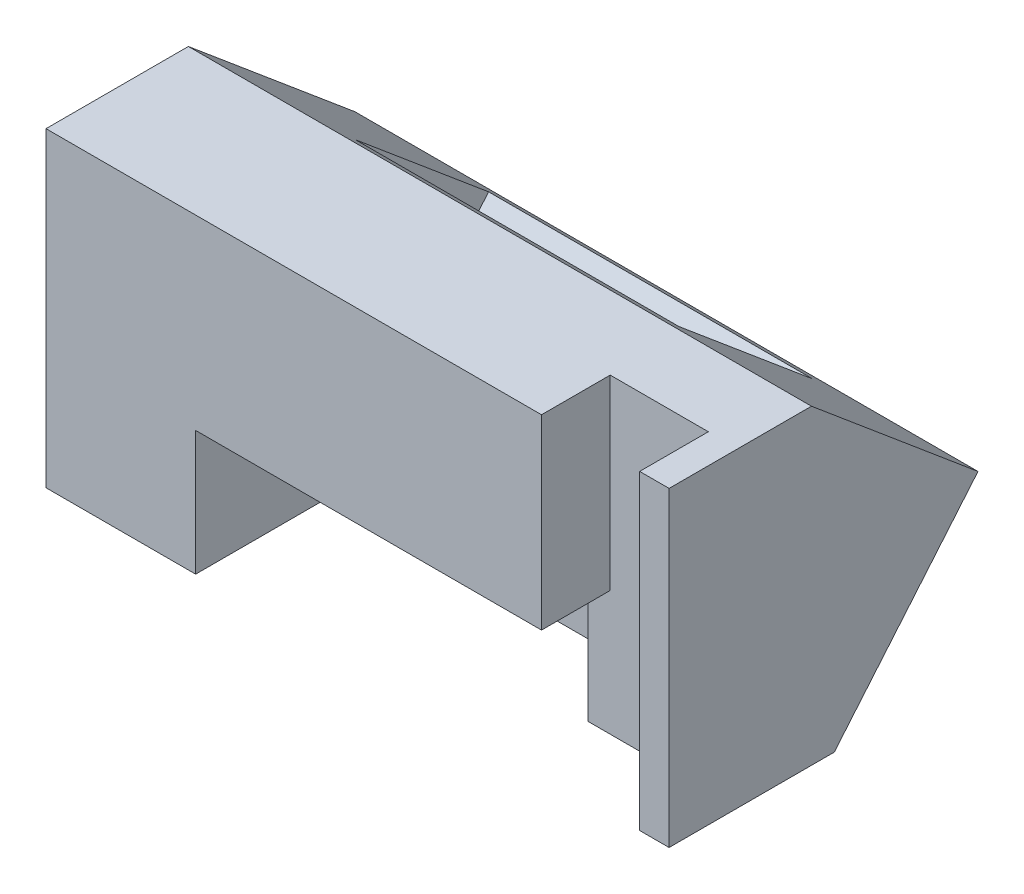
ISO-10303-21;
HEADER;
FILE_DESCRIPTION(('STEP AP214'),'2;1');
FILE_NAME('part.step','',(''),(''),'','','');
FILE_SCHEMA(('AUTOMOTIVE_DESIGN { 1 0 10303 214 1 1 1 1 }'));
ENDSEC;
DATA;
#1=APPLICATION_CONTEXT('core data for automotive mechanical design processes');
#2=APPLICATION_PROTOCOL_DEFINITION('international standard','automotive_design',2000,#1);
#3=PRODUCT_CONTEXT('',#1,'mechanical');
#4=PRODUCT('Part','Part','',(#3));
#5=PRODUCT_RELATED_PRODUCT_CATEGORY('part','',(#4));
#6=PRODUCT_DEFINITION_FORMATION('','',#4);
#7=PRODUCT_DEFINITION_CONTEXT('part definition',#1,'design');
#8=PRODUCT_DEFINITION('design','',#6,#7);
#9=PRODUCT_DEFINITION_SHAPE('','',#8);
#10=(LENGTH_UNIT() NAMED_UNIT(*) SI_UNIT(.MILLI.,.METRE.));
#11=(NAMED_UNIT(*) PLANE_ANGLE_UNIT() SI_UNIT($,.RADIAN.));
#12=(NAMED_UNIT(*) SI_UNIT($,.STERADIAN.) SOLID_ANGLE_UNIT());
#13=UNCERTAINTY_MEASURE_WITH_UNIT(LENGTH_MEASURE(1.E-05),#10,'distance_accuracy_value','');
#14=(GEOMETRIC_REPRESENTATION_CONTEXT(3) GLOBAL_UNCERTAINTY_ASSIGNED_CONTEXT((#13)) GLOBAL_UNIT_ASSIGNED_CONTEXT((#10,
#11,#12)) REPRESENTATION_CONTEXT('',''));
#15=CARTESIAN_POINT('',(0.,0.,0.));
#16=DIRECTION('',(0.,0.,1.));
#17=DIRECTION('',(1.,0.,0.));
#18=AXIS2_PLACEMENT_3D('',#15,#16,#17);
#19=CARTESIAN_POINT('',(30.6696675354404,-237.631657344678,-18.2362424546629));
#20=DIRECTION('',(0.,-1.,0.));
#21=DIRECTION('',(0.,0.,-1.));
#22=AXIS2_PLACEMENT_3D('',#19,#20,#21);
#23=PLANE('',#22);
#24=DIRECTION('',(-1.,0.,0.));
#25=VECTOR('',#24,1.);
#26=CARTESIAN_POINT('',(30.6696675354404,-237.631657344678,-14.3019296888445));
#27=LINE('',#26,#25);
#28=CARTESIAN_POINT('',(11.5,-237.631657344678,-14.3019296888445));
#29=VERTEX_POINT('',#28);
#30=CARTESIAN_POINT('',(6.60000000000002,-237.631657344678,-14.3019296888445));
#31=VERTEX_POINT('',#30);
#32=EDGE_CURVE('E215',#29,#31,#27,.T.);
#33=ORIENTED_EDGE('',*,*,#32,.T.);
#34=DIRECTION('',(0.,0.,1.));
#35=VECTOR('',#34,1.);
#36=CARTESIAN_POINT('',(6.60000000000002,-237.631657344678,-11.5019296888445));
#37=LINE('',#36,#35);
#38=CARTESIAN_POINT('',(6.60000000000002,-237.631657344678,-17.2161796559872));
#39=VERTEX_POINT('',#38);
#40=EDGE_CURVE('E191',#39,#31,#37,.T.);
#41=ORIENTED_EDGE('',*,*,#40,.F.);
#42=DIRECTION('',(-1.,0.,0.));
#43=VECTOR('',#42,1.);
#44=CARTESIAN_POINT('',(15.7295878058948,-237.631657344678,-17.2161796559872));
#45=LINE('',#44,#43);
#46=CARTESIAN_POINT('',(-6.60000000000002,-237.631657344678,-17.2161796559872));
#47=VERTEX_POINT('',#46);
#48=EDGE_CURVE('E265',#39,#47,#45,.T.);
#49=ORIENTED_EDGE('',*,*,#48,.T.);
#50=DIRECTION('',(0.,0.,1.));
#51=VECTOR('',#50,1.);
#52=CARTESIAN_POINT('',(-6.60000000000002,-237.631657344678,-11.5019296888445));
#53=LINE('',#52,#51);
#54=CARTESIAN_POINT('',(-6.60000000000002,-237.631657344678,-11.5019296888445));
#55=VERTEX_POINT('',#54);
#56=EDGE_CURVE('E220',#47,#55,#53,.T.);
#57=ORIENTED_EDGE('',*,*,#56,.T.);
#58=DIRECTION('',(1.,0.,0.));
#59=VECTOR('',#58,1.);
#60=CARTESIAN_POINT('',(-30.6696675354404,-237.631657344678,-11.5019296888445));
#61=LINE('',#60,#59);
#62=CARTESIAN_POINT('',(-12.7,-237.631657344678,-11.5019296888445));
#63=VERTEX_POINT('',#62);
#64=EDGE_CURVE('E248',#63,#55,#61,.T.);
#65=ORIENTED_EDGE('',*,*,#64,.F.);
#66=DIRECTION('',(0.,0.,1.));
#67=VECTOR('',#66,1.);
#68=CARTESIAN_POINT('',(-12.7,-237.631657344678,-18.2362424546629));
#69=LINE('',#68,#67);
#70=CARTESIAN_POINT('',(-12.7,-237.631657344678,-18.2362424546629));
#71=VERTEX_POINT('',#70);
#72=EDGE_CURVE('E243',#71,#63,#69,.T.);
#73=ORIENTED_EDGE('',*,*,#72,.F.);
#74=DIRECTION('',(-1.,0.,0.));
#75=VECTOR('',#74,1.);
#76=CARTESIAN_POINT('',(30.6696675354404,-237.631657344678,-18.2362424546629));
#77=LINE('',#76,#75);
#78=CARTESIAN_POINT('',(12.7,-237.631657344678,-18.2362424546629));
#79=VERTEX_POINT('',#78);
#80=EDGE_CURVE('E305',#79,#71,#77,.T.);
#81=ORIENTED_EDGE('',*,*,#80,.F.);
#82=DIRECTION('',(0.,0.,1.));
#83=VECTOR('',#82,1.);
#84=CARTESIAN_POINT('',(12.7,-237.631657344678,-18.2362424546629));
#85=LINE('',#84,#83);
#86=CARTESIAN_POINT('',(12.7,-237.631657344678,-11.5019296888445));
#87=VERTEX_POINT('',#86);
#88=EDGE_CURVE('E296',#79,#87,#85,.T.);
#89=ORIENTED_EDGE('',*,*,#88,.T.);
#90=DIRECTION('',(-1.,0.,0.));
#91=VECTOR('',#90,1.);
#92=CARTESIAN_POINT('',(30.6696675354404,-237.631657344678,-11.5019296888445));
#93=LINE('',#92,#91);
#94=CARTESIAN_POINT('',(11.5,-237.631657344678,-11.5019296888445));
#95=VERTEX_POINT('',#94);
#96=EDGE_CURVE('E301',#87,#95,#93,.T.);
#97=ORIENTED_EDGE('',*,*,#96,.T.);
#98=DIRECTION('',(0.,0.,-1.));
#99=VECTOR('',#98,1.);
#100=CARTESIAN_POINT('',(11.5,-237.631657344678,-18.2362424546629));
#101=LINE('',#100,#99);
#102=EDGE_CURVE('E207',#95,#29,#101,.T.);
#103=ORIENTED_EDGE('',*,*,#102,.T.);
#104=EDGE_LOOP('',(#33,#41,#49,#57,#65,#73,#81,#89,#97,#103));
#105=FACE_BOUND('',#104,.T.);
#106=ADVANCED_FACE('F41',(#105),#23,.T.);
#107=CARTESIAN_POINT('',(30.6696675354404,-237.631657344678,-11.5019296888445));
#108=DIRECTION('',(0.,0.,1.));
#109=DIRECTION('',(1.,0.,0.));
#110=AXIS2_PLACEMENT_3D('',#107,#108,#109);
#111=PLANE('',#110);
#112=DIRECTION('',(-1.,0.,0.));
#113=VECTOR('',#112,1.);
#114=CARTESIAN_POINT('',(30.6696675354404,-224.952755468151,-11.5019296888445));
#115=LINE('',#114,#113);
#116=CARTESIAN_POINT('',(12.7,-224.952755468151,-11.5019296888445));
#117=VERTEX_POINT('',#116);
#118=CARTESIAN_POINT('',(11.5,-224.952755468151,-11.5019296888445));
#119=VERTEX_POINT('',#118);
#120=EDGE_CURVE('E314',#117,#119,#115,.T.);
#121=ORIENTED_EDGE('',*,*,#120,.T.);
#122=DIRECTION('',(0.,-1.,0.));
#123=VECTOR('',#122,1.);
#124=CARTESIAN_POINT('',(11.5,-237.631657344678,-11.5019296888445));
#125=LINE('',#124,#123);
#126=EDGE_CURVE('E203',#119,#95,#125,.T.);
#127=ORIENTED_EDGE('',*,*,#126,.T.);
#128=ORIENTED_EDGE('',*,*,#96,.F.);
#129=DIRECTION('',(0.,1.,0.));
#130=VECTOR('',#129,1.);
#131=CARTESIAN_POINT('',(12.7,-237.631657344678,-11.5019296888445));
#132=LINE('',#131,#130);
#133=EDGE_CURVE('E315',#87,#117,#132,.T.);
#134=ORIENTED_EDGE('',*,*,#133,.T.);
#135=EDGE_LOOP('',(#121,#127,#128,#134));
#136=FACE_BOUND('',#135,.T.);
#137=ADVANCED_FACE('F343',(#136),#111,.T.);
#138=DIRECTION('',(-1.,0.,0.));
#139=VECTOR('',#138,1.);
#140=CARTESIAN_POINT('',(15.7295878058948,-232.555940656834,-11.5019296888445));
#141=LINE('',#140,#139);
#142=CARTESIAN_POINT('',(7.5,-232.555940656834,-11.5019296888445));
#143=VERTEX_POINT('',#142);
#144=CARTESIAN_POINT('',(-6.60000000000002,-232.555940656834,-11.5019296888445));
#145=VERTEX_POINT('',#144);
#146=EDGE_CURVE('E180',#143,#145,#141,.T.);
#147=ORIENTED_EDGE('',*,*,#146,.F.);
#148=DIRECTION('',(0.,1.,0.));
#149=VECTOR('',#148,1.);
#150=CARTESIAN_POINT('',(7.5,-237.631657344678,-11.5019296888445));
#151=LINE('',#150,#149);
#152=CARTESIAN_POINT('',(7.5,-224.952755468151,-11.5019296888445));
#153=VERTEX_POINT('',#152);
#154=EDGE_CURVE('E184',#143,#153,#151,.T.);
#155=ORIENTED_EDGE('',*,*,#154,.T.);
#156=CARTESIAN_POINT('',(-12.7,-224.952755468151,-11.5019296888445));
#157=VERTEX_POINT('',#156);
#158=EDGE_CURVE('E318',#153,#157,#115,.T.);
#159=ORIENTED_EDGE('',*,*,#158,.T.);
#160=DIRECTION('',(0.,1.,0.));
#161=VECTOR('',#160,1.);
#162=CARTESIAN_POINT('',(-12.7,-237.631657344678,-11.5019296888445));
#163=LINE('',#162,#161);
#164=EDGE_CURVE('E259',#63,#157,#163,.T.);
#165=ORIENTED_EDGE('',*,*,#164,.F.);
#166=ORIENTED_EDGE('',*,*,#64,.T.);
#167=DIRECTION('',(0.,1.,0.));
#168=VECTOR('',#167,1.);
#169=CARTESIAN_POINT('',(-6.60000000000002,-232.555940656834,-11.5019296888445));
#170=LINE('',#169,#168);
#171=EDGE_CURVE('E186',#55,#145,#170,.T.);
#172=ORIENTED_EDGE('',*,*,#171,.T.);
#173=EDGE_LOOP('',(#147,#155,#159,#165,#166,#172));
#174=FACE_BOUND('',#173,.T.);
#175=ADVANCED_FACE('F182',(#174),#111,.T.);
#176=CARTESIAN_POINT('',(30.6696675354404,-224.952755468151,-11.5019296888445));
#177=DIRECTION('',(0.,1.,0.));
#178=DIRECTION('',(0.,0.,1.));
#179=AXIS2_PLACEMENT_3D('',#176,#177,#178);
#180=PLANE('',#179);
#181=DIRECTION('',(1.,0.,0.));
#182=VECTOR('',#181,1.);
#183=CARTESIAN_POINT('',(30.6696675354404,-224.952755468151,-14.3019296888445));
#184=LINE('',#183,#182);
#185=CARTESIAN_POINT('',(7.5,-224.952755468151,-14.3019296888445));
#186=VERTEX_POINT('',#185);
#187=CARTESIAN_POINT('',(11.5,-224.952755468151,-14.3019296888445));
#188=VERTEX_POINT('',#187);
#189=EDGE_CURVE('E49',#186,#188,#184,.T.);
#190=ORIENTED_EDGE('',*,*,#189,.T.);
#191=DIRECTION('',(0.,0.,1.));
#192=VECTOR('',#191,1.);
#193=CARTESIAN_POINT('',(11.5,-224.952755468151,-11.5019296888445));
#194=LINE('',#193,#192);
#195=EDGE_CURVE('E11',#188,#119,#194,.T.);
#196=ORIENTED_EDGE('',*,*,#195,.T.);
#197=ORIENTED_EDGE('',*,*,#120,.F.);
#198=DIRECTION('',(0.,0.,-1.));
#199=VECTOR('',#198,1.);
#200=CARTESIAN_POINT('',(12.7,-224.952755468151,-11.5019296888445));
#201=LINE('',#200,#199);
#202=CARTESIAN_POINT('',(12.7,-224.952755468151,-17.3044924076234));
#203=VERTEX_POINT('',#202);
#204=EDGE_CURVE('E311',#117,#203,#201,.T.);
#205=ORIENTED_EDGE('',*,*,#204,.T.);
#206=DIRECTION('',(-1.,0.,0.));
#207=VECTOR('',#206,1.);
#208=CARTESIAN_POINT('',(30.6696675354404,-224.952755468151,-17.3044924076234));
#209=LINE('',#208,#207);
#210=CARTESIAN_POINT('',(-12.7,-224.952755468151,-17.3044924076234));
#211=VERTEX_POINT('',#210);
#212=EDGE_CURVE('E310',#203,#211,#209,.T.);
#213=ORIENTED_EDGE('',*,*,#212,.T.);
#214=DIRECTION('',(0.,0.,-1.));
#215=VECTOR('',#214,1.);
#216=CARTESIAN_POINT('',(-12.7,-224.952755468151,-11.5019296888445));
#217=LINE('',#216,#215);
#218=EDGE_CURVE('E256',#157,#211,#217,.T.);
#219=ORIENTED_EDGE('',*,*,#218,.F.);
#220=ORIENTED_EDGE('',*,*,#158,.F.);
#221=DIRECTION('',(0.,0.,-1.));
#222=VECTOR('',#221,1.);
#223=CARTESIAN_POINT('',(7.5,-224.952755468151,-11.5019296888445));
#224=LINE('',#223,#222);
#225=EDGE_CURVE('E201',#153,#186,#224,.T.);
#226=ORIENTED_EDGE('',*,*,#225,.T.);
#227=EDGE_LOOP('',(#190,#196,#197,#205,#213,#219,#220,#226));
#228=FACE_BOUND('',#227,.T.);
#229=ADVANCED_FACE('F330',(#228),#180,.T.);
#230=CARTESIAN_POINT('',(0.,-128.389581051651,107.731650107447));
#231=DIRECTION('',(0.,0.766044443118977,-0.642787609686541));
#232=DIRECTION('',(0.,0.642787609686541,0.766044443118976));
#233=AXIS2_PLACEMENT_3D('',#230,#231,#232);
#234=PLANE('',#233);
#235=DIRECTION('',(-1.,0.,0.));
#236=VECTOR('',#235,1.);
#237=CARTESIAN_POINT('',(15.7295878058948,-231.406873992156,-15.0395788537292));
#238=LINE('',#237,#236);
#239=CARTESIAN_POINT('',(6.60000000000002,-231.406873992156,-15.0395788537292));
#240=VERTEX_POINT('',#239);
#241=CARTESIAN_POINT('',(-6.60000000000002,-231.406873992156,-15.0395788537292));
#242=VERTEX_POINT('',#241);
#243=EDGE_CURVE('E272',#240,#242,#238,.T.);
#244=ORIENTED_EDGE('',*,*,#243,.T.);
#245=DIRECTION('',(0.,-0.642787609686541,-0.766044443118976));
#246=VECTOR('',#245,1.);
#247=CARTESIAN_POINT('',(-6.60000000000002,-230.442692577626,-13.8905121890508));
#248=LINE('',#247,#246);
#249=CARTESIAN_POINT('',(-6.60000000000002,-230.442692577626,-13.8905121890508));
#250=VERTEX_POINT('',#249);
#251=EDGE_CURVE('E233',#250,#242,#248,.T.);
#252=ORIENTED_EDGE('',*,*,#251,.F.);
#253=DIRECTION('',(1.,0.,0.));
#254=VECTOR('',#253,1.);
#255=CARTESIAN_POINT('',(6.60000000000002,-230.442692577626,-13.8905121890508));
#256=LINE('',#255,#254);
#257=CARTESIAN_POINT('',(6.60000000000002,-230.442692577626,-13.8905121890508));
#258=VERTEX_POINT('',#257);
#259=EDGE_CURVE('E287',#250,#258,#256,.T.);
#260=ORIENTED_EDGE('',*,*,#259,.T.);
#261=DIRECTION('',(0.,-0.642787609686541,-0.766044443118976));
#262=VECTOR('',#261,1.);
#263=CARTESIAN_POINT('',(6.60000000000002,-230.442692577626,-13.8905121890508));
#264=LINE('',#263,#262);
#265=EDGE_CURVE('E281',#258,#240,#264,.T.);
#266=ORIENTED_EDGE('',*,*,#265,.T.);
#267=EDGE_LOOP('',(#244,#252,#260,#266));
#268=FACE_BOUND('',#267,.T.);
#269=ADVANCED_FACE('F369',(#268),#234,.T.);
#270=CARTESIAN_POINT('',(12.7,-224.852755468151,-17.34088943105));
#271=DIRECTION('',(1.,0.,0.));
#272=DIRECTION('',(0.,0.,-1.));
#273=AXIS2_PLACEMENT_3D('',#270,#271,#272);
#274=PLANE('',#273);
#275=DIRECTION('',(0.,-0.766044443118982,0.642787609686535));
#276=VECTOR('',#275,1.);
#277=CARTESIAN_POINT('',(12.7,-230.650169638673,-24.0944062138403));
#278=LINE('',#277,#276);
#279=CARTESIAN_POINT('',(12.7,-230.650169638673,-24.0944062138403));
#280=VERTEX_POINT('',#279);
#281=EDGE_CURVE('E302',#280,#79,#278,.T.);
#282=ORIENTED_EDGE('',*,*,#281,.F.);
#283=DIRECTION('',(0.,-0.642787609686543,-0.766044443118975));
#284=VECTOR('',#283,1.);
#285=CARTESIAN_POINT('',(12.7,-224.952755468151,-17.3044924076234));
#286=LINE('',#285,#284);
#287=EDGE_CURVE('E307',#203,#280,#286,.T.);
#288=ORIENTED_EDGE('',*,*,#287,.F.);
#289=ORIENTED_EDGE('',*,*,#204,.F.);
#290=ORIENTED_EDGE('',*,*,#133,.F.);
#291=ORIENTED_EDGE('',*,*,#88,.F.);
#292=EDGE_LOOP('',(#282,#288,#289,#290,#291));
#293=FACE_BOUND('',#292,.T.);
#294=ADVANCED_FACE('F43',(#293),#274,.T.);
#295=CARTESIAN_POINT('',(30.6696675354404,-224.952755468151,-17.3044924076234));
#296=DIRECTION('',(0.,0.766044443118975,-0.642787609686543));
#297=DIRECTION('',(0.,0.642787609686543,0.766044443118975));
#298=AXIS2_PLACEMENT_3D('',#295,#296,#297);
#299=PLANE('',#298);
#300=DIRECTION('',(1.,0.,0.));
#301=VECTOR('',#300,1.);
#302=CARTESIAN_POINT('',(30.6696675354404,-225.540008141665,-18.0043528910444));
#303=LINE('',#302,#301);
#304=CARTESIAN_POINT('',(-6.60000000000002,-225.540008141665,-18.0043528910446));
#305=VERTEX_POINT('',#304);
#306=CARTESIAN_POINT('',(6.60000000000002,-225.540008141665,-18.0043528910446));
#307=VERTEX_POINT('',#306);
#308=EDGE_CURVE('E326',#305,#307,#303,.T.);
#309=ORIENTED_EDGE('',*,*,#308,.F.);
#310=DIRECTION('',(0.,-0.642787609686541,-0.766044443118976));
#311=VECTOR('',#310,1.);
#312=CARTESIAN_POINT('',(-6.60000000000002,-225.540008141665,-18.0043528910446));
#313=LINE('',#312,#311);
#314=CARTESIAN_POINT('',(-6.60000000000002,-230.103800170439,-23.4432684371891));
#315=VERTEX_POINT('',#314);
#316=EDGE_CURVE('E224',#305,#315,#313,.T.);
#317=ORIENTED_EDGE('',*,*,#316,.T.);
#318=DIRECTION('',(-1.,0.,0.));
#319=VECTOR('',#318,1.);
#320=CARTESIAN_POINT('',(6.60000000000002,-230.103800170439,-23.4432684371893));
#321=LINE('',#320,#319);
#322=CARTESIAN_POINT('',(6.60000000000002,-230.103800170439,-23.4432684371891));
#323=VERTEX_POINT('',#322);
#324=EDGE_CURVE('E291',#323,#315,#321,.T.);
#325=ORIENTED_EDGE('',*,*,#324,.F.);
#326=DIRECTION('',(0.,-0.642787609686541,-0.766044443118976));
#327=VECTOR('',#326,1.);
#328=CARTESIAN_POINT('',(6.60000000000002,-225.540008141665,-18.0043528910446));
#329=LINE('',#328,#327);
#330=EDGE_CURVE('E280',#307,#323,#329,.T.);
#331=ORIENTED_EDGE('',*,*,#330,.F.);
#332=EDGE_LOOP('',(#309,#317,#325,#331));
#333=FACE_BOUND('',#332,.T.);
#334=DIRECTION('',(0.,-0.642787609686543,-0.766044443118975));
#335=VECTOR('',#334,1.);
#336=CARTESIAN_POINT('',(-12.7,-224.952755468151,-17.3044924076234));
#337=LINE('',#336,#335);
#338=CARTESIAN_POINT('',(-12.7,-230.650169638673,-24.0944062138403));
#339=VERTEX_POINT('',#338);
#340=EDGE_CURVE('E253',#211,#339,#337,.T.);
#341=ORIENTED_EDGE('',*,*,#340,.F.);
#342=ORIENTED_EDGE('',*,*,#212,.F.);
#343=ORIENTED_EDGE('',*,*,#287,.T.);
#344=DIRECTION('',(-1.,0.,0.));
#345=VECTOR('',#344,1.);
#346=CARTESIAN_POINT('',(30.6696675354404,-230.650169638673,-24.0944062138403));
#347=LINE('',#346,#345);
#348=EDGE_CURVE('E306',#280,#339,#347,.T.);
#349=ORIENTED_EDGE('',*,*,#348,.T.);
#350=EDGE_LOOP('',(#341,#342,#343,#349));
#351=FACE_BOUND('',#350,.T.);
#352=ADVANCED_FACE('F350',(#333,#351),#299,.T.);
#353=CARTESIAN_POINT('',(30.6696675354404,-230.650169638673,-24.0944062138403));
#354=DIRECTION('',(0.,-0.642787609686535,-0.766044443118981));
#355=DIRECTION('',(0.,0.766044443118982,-0.642787609686535));
#356=AXIS2_PLACEMENT_3D('',#353,#354,#355);
#357=PLANE('',#356);
#358=ORIENTED_EDGE('',*,*,#348,.F.);
#359=ORIENTED_EDGE('',*,*,#281,.T.);
#360=ORIENTED_EDGE('',*,*,#80,.T.);
#361=DIRECTION('',(0.,-0.766044443118982,0.642787609686535));
#362=VECTOR('',#361,1.);
#363=CARTESIAN_POINT('',(-12.7,-230.650169638673,-24.0944062138403));
#364=LINE('',#363,#362);
#365=EDGE_CURVE('E249',#339,#71,#364,.T.);
#366=ORIENTED_EDGE('',*,*,#365,.F.);
#367=EDGE_LOOP('',(#358,#359,#360,#366));
#368=FACE_BOUND('',#367,.T.);
#369=ADVANCED_FACE('F416',(#368),#357,.T.);
#370=DIRECTION('',(-1.,0.,0.));
#371=VECTOR('',#370,1.);
#372=CARTESIAN_POINT('',(15.7295878058948,-234.042303191871,-18.180361070517));
#373=LINE('',#372,#371);
#374=CARTESIAN_POINT('',(6.60000000000002,-234.042303191871,-18.180361070517));
#375=VERTEX_POINT('',#374);
#376=CARTESIAN_POINT('',(-6.60000000000002,-234.042303191871,-18.180361070517));
#377=VERTEX_POINT('',#376);
#378=EDGE_CURVE('E270',#375,#377,#373,.T.);
#379=ORIENTED_EDGE('',*,*,#378,.F.);
#380=CARTESIAN_POINT('',(6.60000000000002,-235.006484606401,-19.3294277351955));
#381=VERTEX_POINT('',#380);
#382=EDGE_CURVE('E285',#375,#381,#264,.T.);
#383=ORIENTED_EDGE('',*,*,#382,.T.);
#384=DIRECTION('',(-1.,0.,0.));
#385=VECTOR('',#384,1.);
#386=CARTESIAN_POINT('',(6.60000000000002,-235.006484606401,-19.3294277351955));
#387=LINE('',#386,#385);
#388=CARTESIAN_POINT('',(-6.60000000000002,-235.006484606401,-19.3294277351955));
#389=VERTEX_POINT('',#388);
#390=EDGE_CURVE('E284',#381,#389,#387,.T.);
#391=ORIENTED_EDGE('',*,*,#390,.T.);
#392=EDGE_CURVE('E237',#377,#389,#248,.T.);
#393=ORIENTED_EDGE('',*,*,#392,.F.);
#394=EDGE_LOOP('',(#379,#383,#391,#393));
#395=FACE_BOUND('',#394,.T.);
#396=ADVANCED_FACE('F386',(#395),#234,.T.);
#397=CARTESIAN_POINT('',(6.60000000000002,-230.442692577626,-13.8905121890508));
#398=DIRECTION('',(0.,0.642787609686541,0.766044443118977));
#399=DIRECTION('',(0.,-0.766044443118977,0.642787609686541));
#400=AXIS2_PLACEMENT_3D('',#397,#398,#399);
#401=PLANE('',#400);
#402=ORIENTED_EDGE('',*,*,#308,.T.);
#403=DIRECTION('',(0.,0.766044443118977,-0.642787609686541));
#404=VECTOR('',#403,1.);
#405=CARTESIAN_POINT('',(6.60000000000002,-230.442692577626,-13.8905121890508));
#406=LINE('',#405,#404);
#407=EDGE_CURVE('E293',#258,#307,#406,.T.);
#408=ORIENTED_EDGE('',*,*,#407,.F.);
#409=ORIENTED_EDGE('',*,*,#259,.F.);
#410=DIRECTION('',(0.,0.766044443118977,-0.642787609686541));
#411=VECTOR('',#410,1.);
#412=CARTESIAN_POINT('',(-6.60000000000002,-230.442692577626,-13.8905121890508));
#413=LINE('',#412,#411);
#414=EDGE_CURVE('E240',#250,#305,#413,.T.);
#415=ORIENTED_EDGE('',*,*,#414,.T.);
#416=EDGE_LOOP('',(#402,#408,#409,#415));
#417=FACE_BOUND('',#416,.T.);
#418=ADVANCED_FACE('F422',(#417),#401,.F.);
#419=CARTESIAN_POINT('',(6.60000000000002,-235.006484606401,-19.3294277351955));
#420=DIRECTION('',(0.,-0.642787609686541,-0.766044443118977));
#421=DIRECTION('',(0.,0.766044443118977,-0.642787609686541));
#422=AXIS2_PLACEMENT_3D('',#419,#420,#421);
#423=PLANE('',#422);
#424=ORIENTED_EDGE('',*,*,#390,.F.);
#425=DIRECTION('',(0.,0.766044443118977,-0.642787609686541));
#426=VECTOR('',#425,1.);
#427=CARTESIAN_POINT('',(6.60000000000002,-235.006484606401,-19.3294277351955));
#428=LINE('',#427,#426);
#429=EDGE_CURVE('E289',#381,#323,#428,.T.);
#430=ORIENTED_EDGE('',*,*,#429,.T.);
#431=ORIENTED_EDGE('',*,*,#324,.T.);
#432=DIRECTION('',(0.,0.766044443118977,-0.642787609686541));
#433=VECTOR('',#432,1.);
#434=CARTESIAN_POINT('',(-6.60000000000002,-235.006484606401,-19.3294277351955));
#435=LINE('',#434,#433);
#436=EDGE_CURVE('E236',#389,#315,#435,.T.);
#437=ORIENTED_EDGE('',*,*,#436,.F.);
#438=EDGE_LOOP('',(#424,#430,#431,#437));
#439=FACE_BOUND('',#438,.T.);
#440=ADVANCED_FACE('F380',(#439),#423,.F.);
#441=CARTESIAN_POINT('',(6.60000000000002,-230.442692577626,-13.8905121890508));
#442=DIRECTION('',(1.,0.,0.));
#443=DIRECTION('',(0.,0.,-1.));
#444=AXIS2_PLACEMENT_3D('',#441,#442,#443);
#445=PLANE('',#444);
#446=DIRECTION('',(0.,1.,0.));
#447=VECTOR('',#446,1.);
#448=CARTESIAN_POINT('',(6.60000000000002,-232.555940656834,-14.3019296888445));
#449=LINE('',#448,#447);
#450=CARTESIAN_POINT('',(6.60000000000002,-232.555940656834,-14.3019296888445));
#451=VERTEX_POINT('',#450);
#452=EDGE_CURVE('E614',#31,#451,#449,.T.);
#453=ORIENTED_EDGE('',*,*,#452,.T.);
#454=DIRECTION('',(0.,0.,1.));
#455=VECTOR('',#454,1.);
#456=CARTESIAN_POINT('',(6.60000000000002,-232.555940656834,-19.4568205601677));
#457=LINE('',#456,#455);
#458=CARTESIAN_POINT('',(6.60000000000002,-232.555940656834,-14.0753974391994));
#459=VERTEX_POINT('',#458);
#460=EDGE_CURVE('E197',#451,#459,#457,.T.);
#461=ORIENTED_EDGE('',*,*,#460,.T.);
#462=DIRECTION('',(0.,0.766044443118986,-0.64278760968653));
#463=VECTOR('',#462,1.);
#464=CARTESIAN_POINT('',(6.60000000000002,-231.406873992156,-15.0395788537292));
#465=LINE('',#464,#463);
#466=EDGE_CURVE('E64',#459,#240,#465,.T.);
#467=ORIENTED_EDGE('',*,*,#466,.T.);
#468=ORIENTED_EDGE('',*,*,#265,.F.);
#469=ORIENTED_EDGE('',*,*,#407,.T.);
#470=ORIENTED_EDGE('',*,*,#330,.T.);
#471=ORIENTED_EDGE('',*,*,#429,.F.);
#472=ORIENTED_EDGE('',*,*,#382,.F.);
#473=DIRECTION('',(0.,-0.766044443118968,0.642787609686551));
#474=VECTOR('',#473,1.);
#475=CARTESIAN_POINT('',(6.60000000000002,-235.191369856549,-17.2161796559872));
#476=LINE('',#475,#474);
#477=CARTESIAN_POINT('',(6.60000000000002,-235.191369856549,-17.2161796559872));
#478=VERTEX_POINT('',#477);
#479=EDGE_CURVE('E266',#375,#478,#476,.T.);
#480=ORIENTED_EDGE('',*,*,#479,.T.);
#481=DIRECTION('',(0.,-1.,0.));
#482=VECTOR('',#481,1.);
#483=CARTESIAN_POINT('',(6.60000000000002,-237.631657344678,-17.2161796559872));
#484=LINE('',#483,#482);
#485=EDGE_CURVE('E252',#478,#39,#484,.T.);
#486=ORIENTED_EDGE('',*,*,#485,.T.);
#487=ORIENTED_EDGE('',*,*,#40,.T.);
#488=EDGE_LOOP('',(#453,#461,#467,#468,#469,#470,#471,#472,#480,#486,#487));
#489=FACE_BOUND('',#488,.T.);
#490=ADVANCED_FACE('F371',(#489),#445,.F.);
#491=CARTESIAN_POINT('',(15.7295878058948,-237.631657344678,-17.2161796559872));
#492=DIRECTION('',(0.,0.,-1.));
#493=DIRECTION('',(-1.,0.,0.));
#494=AXIS2_PLACEMENT_3D('',#491,#492,#493);
#495=PLANE('',#494);
#496=DIRECTION('',(-1.,0.,0.));
#497=VECTOR('',#496,1.);
#498=CARTESIAN_POINT('',(15.7295878058948,-235.191369856549,-17.2161796559872));
#499=LINE('',#498,#497);
#500=CARTESIAN_POINT('',(-6.60000000000002,-235.191369856549,-17.2161796559872));
#501=VERTEX_POINT('',#500);
#502=EDGE_CURVE('E269',#478,#501,#499,.T.);
#503=ORIENTED_EDGE('',*,*,#502,.T.);
#504=DIRECTION('',(0.,-1.,0.));
#505=VECTOR('',#504,1.);
#506=CARTESIAN_POINT('',(-6.60000000000002,-237.631657344678,-17.2161796559872));
#507=LINE('',#506,#505);
#508=EDGE_CURVE('E217',#501,#47,#507,.T.);
#509=ORIENTED_EDGE('',*,*,#508,.T.);
#510=ORIENTED_EDGE('',*,*,#48,.F.);
#511=ORIENTED_EDGE('',*,*,#485,.F.);
#512=EDGE_LOOP('',(#503,#509,#510,#511));
#513=FACE_BOUND('',#512,.T.);
#514=ADVANCED_FACE('F392',(#513),#495,.F.);
#515=CARTESIAN_POINT('',(15.7295878058948,-232.555940656834,-14.0753974391994));
#516=DIRECTION('',(0.,1.,0.));
#517=DIRECTION('',(0.,0.,1.));
#518=AXIS2_PLACEMENT_3D('',#515,#516,#517);
#519=PLANE('',#518);
#520=ORIENTED_EDGE('',*,*,#146,.T.);
#521=DIRECTION('',(0.,0.,-1.));
#522=VECTOR('',#521,1.);
#523=CARTESIAN_POINT('',(-6.60000000000002,-232.555940656834,-14.0753974391994));
#524=LINE('',#523,#522);
#525=CARTESIAN_POINT('',(-6.60000000000002,-232.555940656834,-14.0753974391994));
#526=VERTEX_POINT('',#525);
#527=EDGE_CURVE('E228',#145,#526,#524,.T.);
#528=ORIENTED_EDGE('',*,*,#527,.T.);
#529=DIRECTION('',(-1.,0.,0.));
#530=VECTOR('',#529,1.);
#531=CARTESIAN_POINT('',(15.7295878058948,-232.555940656834,-14.0753974391994));
#532=LINE('',#531,#530);
#533=EDGE_CURVE('E190',#459,#526,#532,.T.);
#534=ORIENTED_EDGE('',*,*,#533,.F.);
#535=ORIENTED_EDGE('',*,*,#460,.F.);
#536=DIRECTION('',(1.,0.,0.));
#537=VECTOR('',#536,1.);
#538=CARTESIAN_POINT('',(6.60000000000002,-232.555940656834,-14.3019296888445));
#539=LINE('',#538,#537);
#540=CARTESIAN_POINT('',(7.5,-232.555940656834,-14.3019296888445));
#541=VERTEX_POINT('',#540);
#542=EDGE_CURVE('E196',#451,#541,#539,.T.);
#543=ORIENTED_EDGE('',*,*,#542,.T.);
#544=DIRECTION('',(0.,0.,1.));
#545=VECTOR('',#544,1.);
#546=CARTESIAN_POINT('',(7.5,-232.555940656834,-19.4568205601677));
#547=LINE('',#546,#545);
#548=EDGE_CURVE('E193',#541,#143,#547,.T.);
#549=ORIENTED_EDGE('',*,*,#548,.T.);
#550=EDGE_LOOP('',(#520,#528,#534,#535,#543,#549));
#551=FACE_BOUND('',#550,.T.);
#552=ADVANCED_FACE('F194',(#551),#519,.F.);
#553=CARTESIAN_POINT('',(15.7295878058948,-231.406873992156,-15.0395788537292));
#554=DIRECTION('',(0.,0.64278760968653,0.766044443118986));
#555=DIRECTION('',(0.,-0.766044443118986,0.64278760968653));
#556=AXIS2_PLACEMENT_3D('',#553,#554,#555);
#557=PLANE('',#556);
#558=ORIENTED_EDGE('',*,*,#533,.T.);
#559=DIRECTION('',(0.,0.766044443118986,-0.64278760968653));
#560=VECTOR('',#559,1.);
#561=CARTESIAN_POINT('',(-6.60000000000002,-231.406873992156,-15.0395788537292));
#562=LINE('',#561,#560);
#563=EDGE_CURVE('E225',#526,#242,#562,.T.);
#564=ORIENTED_EDGE('',*,*,#563,.T.);
#565=ORIENTED_EDGE('',*,*,#243,.F.);
#566=ORIENTED_EDGE('',*,*,#466,.F.);
#567=EDGE_LOOP('',(#558,#564,#565,#566));
#568=FACE_BOUND('',#567,.T.);
#569=ADVANCED_FACE('F366',(#568),#557,.F.);
#570=CARTESIAN_POINT('',(15.7295878058948,-235.191369856549,-17.2161796559872));
#571=DIRECTION('',(0.,-0.642787609686551,-0.766044443118968));
#572=DIRECTION('',(0.,0.766044443118968,-0.642787609686551));
#573=AXIS2_PLACEMENT_3D('',#570,#571,#572);
#574=PLANE('',#573);
#575=ORIENTED_EDGE('',*,*,#378,.T.);
#576=DIRECTION('',(0.,-0.766044443118968,0.642787609686551));
#577=VECTOR('',#576,1.);
#578=CARTESIAN_POINT('',(-6.60000000000002,-235.191369856549,-17.2161796559872));
#579=LINE('',#578,#577);
#580=EDGE_CURVE('E221',#377,#501,#579,.T.);
#581=ORIENTED_EDGE('',*,*,#580,.T.);
#582=ORIENTED_EDGE('',*,*,#502,.F.);
#583=ORIENTED_EDGE('',*,*,#479,.F.);
#584=EDGE_LOOP('',(#575,#581,#582,#583));
#585=FACE_BOUND('',#584,.T.);
#586=ADVANCED_FACE('F390',(#585),#574,.F.);
#587=CARTESIAN_POINT('',(-12.7,-224.852755468151,-17.34088943105));
#588=DIRECTION('',(-1.,0.,0.));
#589=DIRECTION('',(0.,0.,-1.));
#590=AXIS2_PLACEMENT_3D('',#587,#588,#589);
#591=PLANE('',#590);
#592=ORIENTED_EDGE('',*,*,#365,.T.);
#593=ORIENTED_EDGE('',*,*,#72,.T.);
#594=ORIENTED_EDGE('',*,*,#164,.T.);
#595=ORIENTED_EDGE('',*,*,#218,.T.);
#596=ORIENTED_EDGE('',*,*,#340,.T.);
#597=EDGE_LOOP('',(#592,#593,#594,#595,#596));
#598=FACE_BOUND('',#597,.T.);
#599=ADVANCED_FACE('F353',(#598),#591,.T.);
#600=CARTESIAN_POINT('',(-6.60000000000002,-230.442692577626,-13.8905121890508));
#601=DIRECTION('',(-1.,0.,0.));
#602=DIRECTION('',(0.,0.,-1.));
#603=AXIS2_PLACEMENT_3D('',#600,#601,#602);
#604=PLANE('',#603);
#605=ORIENTED_EDGE('',*,*,#316,.F.);
#606=ORIENTED_EDGE('',*,*,#414,.F.);
#607=ORIENTED_EDGE('',*,*,#251,.T.);
#608=ORIENTED_EDGE('',*,*,#563,.F.);
#609=ORIENTED_EDGE('',*,*,#527,.F.);
#610=ORIENTED_EDGE('',*,*,#171,.F.);
#611=ORIENTED_EDGE('',*,*,#56,.F.);
#612=ORIENTED_EDGE('',*,*,#508,.F.);
#613=ORIENTED_EDGE('',*,*,#580,.F.);
#614=ORIENTED_EDGE('',*,*,#392,.T.);
#615=ORIENTED_EDGE('',*,*,#436,.T.);
#616=EDGE_LOOP('',(#605,#606,#607,#608,#609,#610,#611,#612,#613,#614,#615));
#617=FACE_BOUND('',#616,.T.);
#618=ADVANCED_FACE('F360',(#617),#604,.F.);
#619=CARTESIAN_POINT('',(7.5,-211.931657344678,-14.3019296888445));
#620=DIRECTION('',(0.,0.,1.));
#621=DIRECTION('',(1.,0.,0.));
#622=AXIS2_PLACEMENT_3D('',#619,#620,#621);
#623=PLANE('',#622);
#624=DIRECTION('',(0.,-1.,0.));
#625=VECTOR('',#624,1.);
#626=CARTESIAN_POINT('',(11.5,-211.931657344678,-14.3019296888445));
#627=LINE('',#626,#625);
#628=EDGE_CURVE('E204',#188,#29,#627,.T.);
#629=ORIENTED_EDGE('',*,*,#628,.F.);
#630=ORIENTED_EDGE('',*,*,#189,.F.);
#631=DIRECTION('',(0.,-1.,0.));
#632=VECTOR('',#631,1.);
#633=CARTESIAN_POINT('',(7.5,-211.931657344678,-14.3019296888445));
#634=LINE('',#633,#632);
#635=EDGE_CURVE('E56',#186,#541,#634,.T.);
#636=ORIENTED_EDGE('',*,*,#635,.T.);
#637=ORIENTED_EDGE('',*,*,#542,.F.);
#638=ORIENTED_EDGE('',*,*,#452,.F.);
#639=ORIENTED_EDGE('',*,*,#32,.F.);
#640=EDGE_LOOP('',(#629,#630,#636,#637,#638,#639));
#641=FACE_BOUND('',#640,.T.);
#642=ADVANCED_FACE('F334',(#641),#623,.T.);
#643=CARTESIAN_POINT('',(11.5,-211.931657344678,-14.3019296888445));
#644=DIRECTION('',(-1.,0.,0.));
#645=DIRECTION('',(0.,0.,1.));
#646=AXIS2_PLACEMENT_3D('',#643,#644,#645);
#647=PLANE('',#646);
#648=ORIENTED_EDGE('',*,*,#126,.F.);
#649=ORIENTED_EDGE('',*,*,#195,.F.);
#650=ORIENTED_EDGE('',*,*,#628,.T.);
#651=ORIENTED_EDGE('',*,*,#102,.F.);
#652=EDGE_LOOP('',(#648,#649,#650,#651));
#653=FACE_BOUND('',#652,.T.);
#654=ADVANCED_FACE('F337',(#653),#647,.T.);
#655=CARTESIAN_POINT('',(7.5,-211.931657344678,-14.3019296888445));
#656=DIRECTION('',(1.,0.,0.));
#657=DIRECTION('',(0.,0.,-1.));
#658=AXIS2_PLACEMENT_3D('',#655,#656,#657);
#659=PLANE('',#658);
#660=ORIENTED_EDGE('',*,*,#548,.F.);
#661=ORIENTED_EDGE('',*,*,#635,.F.);
#662=ORIENTED_EDGE('',*,*,#225,.F.);
#663=ORIENTED_EDGE('',*,*,#154,.F.);
#664=EDGE_LOOP('',(#660,#661,#662,#663));
#665=FACE_BOUND('',#664,.T.);
#666=ADVANCED_FACE('F199',(#665),#659,.T.);
#667=CLOSED_SHELL('',(#106,#137,#175,#229,#269,#294,#352,#369,#396,#418,#440,#490,#514,#552,
#569,#586,#599,#618,#642,#654,#666));
#668=MANIFOLD_SOLID_BREP('B2',#667);
#669=ADVANCED_BREP_SHAPE_REPRESENTATION('',(#18,#668),#14);
#670=SHAPE_DEFINITION_REPRESENTATION(#9,#669);
ENDSEC;
END-ISO-10303-21;
